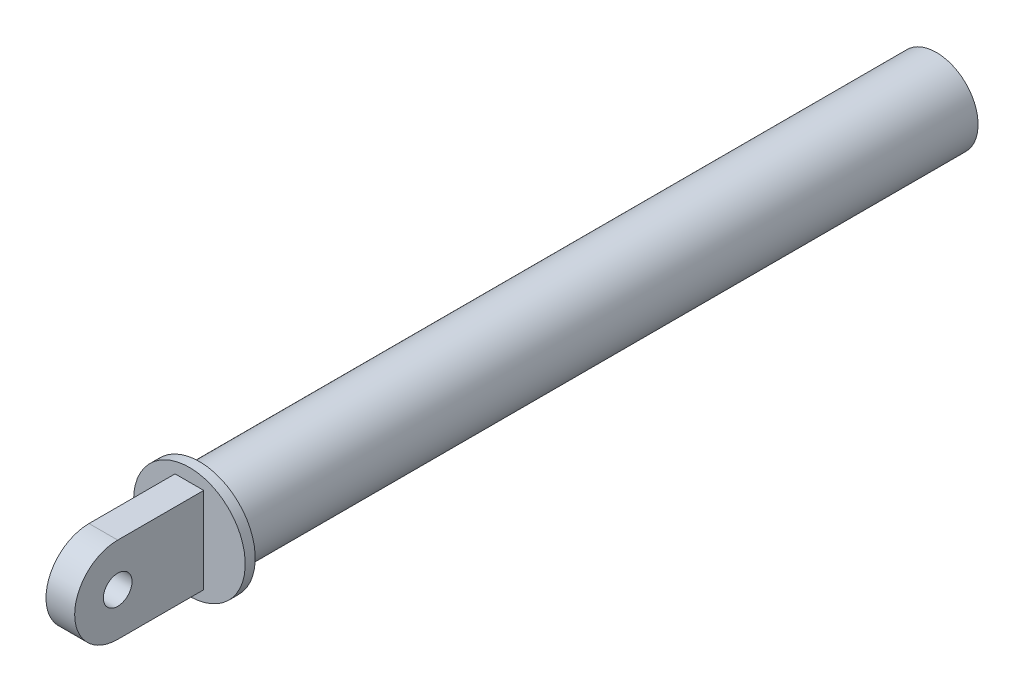
ISO-10303-21;
HEADER;
FILE_DESCRIPTION(('STEP AP214'),'2;1');
FILE_NAME('part.step','',(''),(''),'','','');
FILE_SCHEMA(('AUTOMOTIVE_DESIGN { 1 0 10303 214 1 1 1 1 }'));
ENDSEC;
DATA;
#1=APPLICATION_CONTEXT('core data for automotive mechanical design processes');
#2=APPLICATION_PROTOCOL_DEFINITION('international standard','automotive_design',2000,#1);
#3=PRODUCT_CONTEXT('',#1,'mechanical');
#4=PRODUCT('Part','Part','',(#3));
#5=PRODUCT_RELATED_PRODUCT_CATEGORY('part','',(#4));
#6=PRODUCT_DEFINITION_FORMATION('','',#4);
#7=PRODUCT_DEFINITION_CONTEXT('part definition',#1,'design');
#8=PRODUCT_DEFINITION('design','',#6,#7);
#9=PRODUCT_DEFINITION_SHAPE('','',#8);
#10=(LENGTH_UNIT() NAMED_UNIT(*) SI_UNIT(.MILLI.,.METRE.));
#11=(NAMED_UNIT(*) PLANE_ANGLE_UNIT() SI_UNIT($,.RADIAN.));
#12=(NAMED_UNIT(*) SI_UNIT($,.STERADIAN.) SOLID_ANGLE_UNIT());
#13=UNCERTAINTY_MEASURE_WITH_UNIT(LENGTH_MEASURE(1.E-05),#10,'distance_accuracy_value','');
#14=(GEOMETRIC_REPRESENTATION_CONTEXT(3) GLOBAL_UNCERTAINTY_ASSIGNED_CONTEXT((#13)) GLOBAL_UNIT_ASSIGNED_CONTEXT((#10,
#11,#12)) REPRESENTATION_CONTEXT('',''));
#15=CARTESIAN_POINT('',(0.,0.,0.));
#16=DIRECTION('',(0.,0.,1.));
#17=DIRECTION('',(1.,0.,0.));
#18=AXIS2_PLACEMENT_3D('',#15,#16,#17);
#19=CARTESIAN_POINT('',(5.,15.,0.));
#20=DIRECTION('',(0.,1.,0.));
#21=DIRECTION('',(0.,0.,1.));
#22=AXIS2_PLACEMENT_3D('',#19,#20,#21);
#23=PLANE('',#22);
#24=DIRECTION('',(0.,0.,-1.));
#25=VECTOR('',#24,1.);
#26=CARTESIAN_POINT('',(-5.,15.,0.));
#27=LINE('',#26,#25);
#28=CARTESIAN_POINT('',(-5.,15.,0.));
#29=VERTEX_POINT('',#28);
#30=CARTESIAN_POINT('',(-5.,15.,-30.));
#31=VERTEX_POINT('',#30);
#32=EDGE_CURVE('E90',#29,#31,#27,.T.);
#33=ORIENTED_EDGE('',*,*,#32,.F.);
#34=DIRECTION('',(-1.,0.,0.));
#35=VECTOR('',#34,1.);
#36=CARTESIAN_POINT('',(5.,15.,0.));
#37=LINE('',#36,#35);
#38=CARTESIAN_POINT('',(5.,15.,0.));
#39=VERTEX_POINT('',#38);
#40=EDGE_CURVE('E11',#39,#29,#37,.T.);
#41=ORIENTED_EDGE('',*,*,#40,.F.);
#42=DIRECTION('',(0.,0.,-1.));
#43=VECTOR('',#42,1.);
#44=CARTESIAN_POINT('',(5.,15.,0.));
#45=LINE('',#44,#43);
#46=CARTESIAN_POINT('',(5.,15.,-30.));
#47=VERTEX_POINT('',#46);
#48=EDGE_CURVE('E61',#39,#47,#45,.T.);
#49=ORIENTED_EDGE('',*,*,#48,.T.);
#50=DIRECTION('',(-1.,0.,0.));
#51=VECTOR('',#50,1.);
#52=CARTESIAN_POINT('',(5.,15.,-30.));
#53=LINE('',#52,#51);
#54=EDGE_CURVE('E81',#47,#31,#53,.T.);
#55=ORIENTED_EDGE('',*,*,#54,.T.);
#56=EDGE_LOOP('',(#33,#41,#49,#55));
#57=FACE_BOUND('',#56,.T.);
#58=ADVANCED_FACE('F43',(#57),#23,.T.);
#59=CARTESIAN_POINT('',(5.,0.,0.));
#60=DIRECTION('',(-1.,0.,0.));
#61=DIRECTION('',(0.,0.,1.));
#62=AXIS2_PLACEMENT_3D('',#59,#60,#61);
#63=CYLINDRICAL_SURFACE('',#62,15.);
#64=CARTESIAN_POINT('',(-5.,0.,0.));
#65=DIRECTION('',(1.,0.,0.));
#66=DIRECTION('',(0.,0.,-1.));
#67=AXIS2_PLACEMENT_3D('',#64,#65,#66);
#68=CIRCLE('',#67,15.);
#69=CARTESIAN_POINT('',(-5.,-15.,0.));
#70=VERTEX_POINT('',#69);
#71=EDGE_CURVE('E104',#29,#70,#68,.T.);
#72=ORIENTED_EDGE('',*,*,#71,.T.);
#73=DIRECTION('',(-1.,0.,0.));
#74=VECTOR('',#73,1.);
#75=CARTESIAN_POINT('',(5.,-15.,0.));
#76=LINE('',#75,#74);
#77=CARTESIAN_POINT('',(5.,-15.,0.));
#78=VERTEX_POINT('',#77);
#79=EDGE_CURVE('E53',#78,#70,#76,.T.);
#80=ORIENTED_EDGE('',*,*,#79,.F.);
#81=CARTESIAN_POINT('',(5.,0.,0.));
#82=DIRECTION('',(1.,0.,0.));
#83=DIRECTION('',(0.,0.,-1.));
#84=AXIS2_PLACEMENT_3D('',#81,#82,#83);
#85=CIRCLE('',#84,15.);
#86=EDGE_CURVE('E128',#39,#78,#85,.T.);
#87=ORIENTED_EDGE('',*,*,#86,.F.);
#88=ORIENTED_EDGE('',*,*,#40,.T.);
#89=EDGE_LOOP('',(#72,#80,#87,#88));
#90=FACE_BOUND('',#89,.T.);
#91=ADVANCED_FACE('F169',(#90),#63,.T.);
#92=CARTESIAN_POINT('',(5.,-15.,0.));
#93=DIRECTION('',(0.,1.,0.));
#94=DIRECTION('',(0.,0.,1.));
#95=AXIS2_PLACEMENT_3D('',#92,#93,#94);
#96=PLANE('',#95);
#97=DIRECTION('',(0.,0.,-1.));
#98=VECTOR('',#97,1.);
#99=CARTESIAN_POINT('',(-5.,-15.,0.));
#100=LINE('',#99,#98);
#101=CARTESIAN_POINT('',(-5.,-15.,-30.));
#102=VERTEX_POINT('',#101);
#103=EDGE_CURVE('E76',#70,#102,#100,.T.);
#104=ORIENTED_EDGE('',*,*,#103,.T.);
#105=DIRECTION('',(-1.,0.,0.));
#106=VECTOR('',#105,1.);
#107=CARTESIAN_POINT('',(5.,-15.,-30.));
#108=LINE('',#107,#106);
#109=CARTESIAN_POINT('',(5.,-15.,-30.));
#110=VERTEX_POINT('',#109);
#111=EDGE_CURVE('E99',#110,#102,#108,.T.);
#112=ORIENTED_EDGE('',*,*,#111,.F.);
#113=DIRECTION('',(0.,0.,-1.));
#114=VECTOR('',#113,1.);
#115=CARTESIAN_POINT('',(5.,-15.,0.));
#116=LINE('',#115,#114);
#117=EDGE_CURVE('E125',#78,#110,#116,.T.);
#118=ORIENTED_EDGE('',*,*,#117,.F.);
#119=ORIENTED_EDGE('',*,*,#79,.T.);
#120=EDGE_LOOP('',(#104,#112,#118,#119));
#121=FACE_BOUND('',#120,.T.);
#122=ADVANCED_FACE('F98',(#121),#96,.F.);
#123=CARTESIAN_POINT('',(5.,0.,0.));
#124=DIRECTION('',(-1.,0.,0.));
#125=DIRECTION('',(0.,0.,1.));
#126=AXIS2_PLACEMENT_3D('',#123,#124,#125);
#127=CYLINDRICAL_SURFACE('',#126,5.);
#128=CARTESIAN_POINT('',(5.,0.,0.));
#129=DIRECTION('',(1.,0.,0.));
#130=DIRECTION('',(0.,0.,-1.));
#131=AXIS2_PLACEMENT_3D('',#128,#129,#130);
#132=CIRCLE('',#131,5.);
#133=CARTESIAN_POINT('',(5.,0.,-5.));
#134=VERTEX_POINT('',#133);
#135=EDGE_CURVE('E94',#134,#134,#132,.T.);
#136=ORIENTED_EDGE('',*,*,#135,.T.);
#137=EDGE_LOOP('',(#136));
#138=FACE_BOUND('',#137,.T.);
#139=CARTESIAN_POINT('',(-5.,0.,0.));
#140=DIRECTION('',(1.,0.,0.));
#141=DIRECTION('',(0.,0.,-1.));
#142=AXIS2_PLACEMENT_3D('',#139,#140,#141);
#143=CIRCLE('',#142,5.);
#144=CARTESIAN_POINT('',(-5.,0.,-5.));
#145=VERTEX_POINT('',#144);
#146=EDGE_CURVE('E118',#145,#145,#143,.T.);
#147=ORIENTED_EDGE('',*,*,#146,.F.);
#148=EDGE_LOOP('',(#147));
#149=FACE_BOUND('',#148,.T.);
#150=ADVANCED_FACE('F45',(#138,#149),#127,.F.);
#151=CARTESIAN_POINT('',(5.,0.,0.));
#152=DIRECTION('',(1.,0.,0.));
#153=DIRECTION('',(0.,0.,-1.));
#154=AXIS2_PLACEMENT_3D('',#151,#152,#153);
#155=PLANE('',#154);
#156=ORIENTED_EDGE('',*,*,#135,.F.);
#157=EDGE_LOOP('',(#156));
#158=FACE_BOUND('',#157,.T.);
#159=ORIENTED_EDGE('',*,*,#48,.F.);
#160=ORIENTED_EDGE('',*,*,#86,.T.);
#161=ORIENTED_EDGE('',*,*,#117,.T.);
#162=DIRECTION('',(0.,-1.,0.));
#163=VECTOR('',#162,1.);
#164=CARTESIAN_POINT('',(5.,0.,-30.));
#165=LINE('',#164,#163);
#166=EDGE_CURVE('E107',#47,#110,#165,.T.);
#167=ORIENTED_EDGE('',*,*,#166,.F.);
#168=EDGE_LOOP('',(#159,#160,#161,#167));
#169=FACE_BOUND('',#168,.T.);
#170=ADVANCED_FACE('F180',(#158,#169),#155,.T.);
#171=CARTESIAN_POINT('',(-5.,0.,0.));
#172=DIRECTION('',(1.,0.,0.));
#173=DIRECTION('',(0.,0.,-1.));
#174=AXIS2_PLACEMENT_3D('',#171,#172,#173);
#175=PLANE('',#174);
#176=ORIENTED_EDGE('',*,*,#146,.T.);
#177=EDGE_LOOP('',(#176));
#178=FACE_BOUND('',#177,.T.);
#179=ORIENTED_EDGE('',*,*,#32,.T.);
#180=DIRECTION('',(0.,-1.,0.));
#181=VECTOR('',#180,1.);
#182=CARTESIAN_POINT('',(-5.,0.,-30.));
#183=LINE('',#182,#181);
#184=EDGE_CURVE('E88',#31,#102,#183,.T.);
#185=ORIENTED_EDGE('',*,*,#184,.T.);
#186=ORIENTED_EDGE('',*,*,#103,.F.);
#187=ORIENTED_EDGE('',*,*,#71,.F.);
#188=EDGE_LOOP('',(#179,#185,#186,#187));
#189=FACE_BOUND('',#188,.T.);
#190=ADVANCED_FACE('F89',(#178,#189),#175,.F.);
#191=CARTESIAN_POINT('',(0.,0.,-30.));
#192=DIRECTION('',(0.,0.,1.));
#193=DIRECTION('',(1.,0.,0.));
#194=AXIS2_PLACEMENT_3D('',#191,#192,#193);
#195=PLANE('',#194);
#196=CARTESIAN_POINT('',(0.,0.,-30.));
#197=DIRECTION('',(0.,0.,-1.));
#198=DIRECTION('',(-1.,0.,0.));
#199=AXIS2_PLACEMENT_3D('',#196,#197,#198);
#200=CIRCLE('',#199,19.4638759298954);
#201=CARTESIAN_POINT('',(-19.4638759298954,0.,-30.));
#202=VERTEX_POINT('',#201);
#203=EDGE_CURVE('E122',#202,#202,#200,.T.);
#204=ORIENTED_EDGE('',*,*,#203,.F.);
#205=EDGE_LOOP('',(#204));
#206=FACE_BOUND('',#205,.T.);
#207=ORIENTED_EDGE('',*,*,#184,.F.);
#208=ORIENTED_EDGE('',*,*,#54,.F.);
#209=ORIENTED_EDGE('',*,*,#166,.T.);
#210=ORIENTED_EDGE('',*,*,#111,.T.);
#211=EDGE_LOOP('',(#207,#208,#209,#210));
#212=FACE_BOUND('',#211,.T.);
#213=ADVANCED_FACE('F106',(#206,#212),#195,.T.);
#214=CARTESIAN_POINT('',(0.,0.,-290.484846338785));
#215=DIRECTION('',(0.,0.,-1.));
#216=DIRECTION('',(-1.,0.,0.));
#217=AXIS2_PLACEMENT_3D('',#214,#215,#216);
#218=CYLINDRICAL_SURFACE('',#217,19.4638759298954);
#219=ORIENTED_EDGE('',*,*,#203,.T.);
#220=EDGE_LOOP('',(#219));
#221=FACE_BOUND('',#220,.T.);
#222=CARTESIAN_POINT('',(0.,0.,-33.5002521750095));
#223=DIRECTION('',(0.,0.,-1.));
#224=DIRECTION('',(-1.,0.,0.));
#225=AXIS2_PLACEMENT_3D('',#222,#223,#224);
#226=CIRCLE('',#225,19.4638759298954);
#227=CARTESIAN_POINT('',(-19.4638759298954,0.,-33.5002521750095));
#228=VERTEX_POINT('',#227);
#229=EDGE_CURVE('E140',#228,#228,#226,.T.);
#230=ORIENTED_EDGE('',*,*,#229,.F.);
#231=EDGE_LOOP('',(#230));
#232=FACE_BOUND('',#231,.T.);
#233=ADVANCED_FACE('F165',(#221,#232),#218,.T.);
#234=CARTESIAN_POINT('',(0.,19.4638759298954,-33.5002521750095));
#235=DIRECTION('',(0.,0.,-1.));
#236=DIRECTION('',(-1.,0.,0.));
#237=AXIS2_PLACEMENT_3D('',#234,#235,#236);
#238=PLANE('',#237);
#239=ORIENTED_EDGE('',*,*,#229,.T.);
#240=EDGE_LOOP('',(#239));
#241=FACE_BOUND('',#240,.T.);
#242=CARTESIAN_POINT('',(0.,0.,-33.5002521750095));
#243=DIRECTION('',(0.,0.,-1.));
#244=DIRECTION('',(-1.,0.,0.));
#245=AXIS2_PLACEMENT_3D('',#242,#243,#244);
#246=CIRCLE('',#245,14.525280544698);
#247=CARTESIAN_POINT('',(-14.525280544698,0.,-33.5002521750095));
#248=VERTEX_POINT('',#247);
#249=EDGE_CURVE('E144',#248,#248,#246,.T.);
#250=ORIENTED_EDGE('',*,*,#249,.F.);
#251=EDGE_LOOP('',(#250));
#252=FACE_BOUND('',#251,.T.);
#253=ADVANCED_FACE('F157',(#241,#252),#238,.T.);
#254=CARTESIAN_POINT('',(0.,0.,-290.484846338785));
#255=DIRECTION('',(0.,0.,-1.));
#256=DIRECTION('',(-1.,0.,0.));
#257=AXIS2_PLACEMENT_3D('',#254,#255,#256);
#258=CYLINDRICAL_SURFACE('',#257,14.525280544698);
#259=ORIENTED_EDGE('',*,*,#249,.T.);
#260=EDGE_LOOP('',(#259));
#261=FACE_BOUND('',#260,.T.);
#262=CARTESIAN_POINT('',(0.,0.,-290.484846338785));
#263=DIRECTION('',(0.,0.,-1.));
#264=DIRECTION('',(-1.,0.,0.));
#265=AXIS2_PLACEMENT_3D('',#262,#263,#264);
#266=CIRCLE('',#265,14.525280544698);
#267=CARTESIAN_POINT('',(-14.525280544698,0.,-290.484846338785));
#268=VERTEX_POINT('',#267);
#269=EDGE_CURVE('E148',#268,#268,#266,.T.);
#270=ORIENTED_EDGE('',*,*,#269,.F.);
#271=EDGE_LOOP('',(#270));
#272=FACE_BOUND('',#271,.T.);
#273=ADVANCED_FACE('F155',(#261,#272),#258,.T.);
#274=CARTESIAN_POINT('',(0.,14.525280544698,-290.484846338785));
#275=DIRECTION('',(0.,0.,-1.));
#276=DIRECTION('',(-1.,0.,0.));
#277=AXIS2_PLACEMENT_3D('',#274,#275,#276);
#278=PLANE('',#277);
#279=ORIENTED_EDGE('',*,*,#269,.T.);
#280=EDGE_LOOP('',(#279));
#281=FACE_BOUND('',#280,.T.);
#282=ADVANCED_FACE('F153',(#281),#278,.T.);
#283=CLOSED_SHELL('',(#58,#91,#122,#150,#170,#190,#213,#233,#253,#273,#282));
#284=MANIFOLD_SOLID_BREP('B2',#283);
#285=ADVANCED_BREP_SHAPE_REPRESENTATION('',(#18,#284),#14);
#286=SHAPE_DEFINITION_REPRESENTATION(#9,#285);
ENDSEC;
END-ISO-10303-21;
